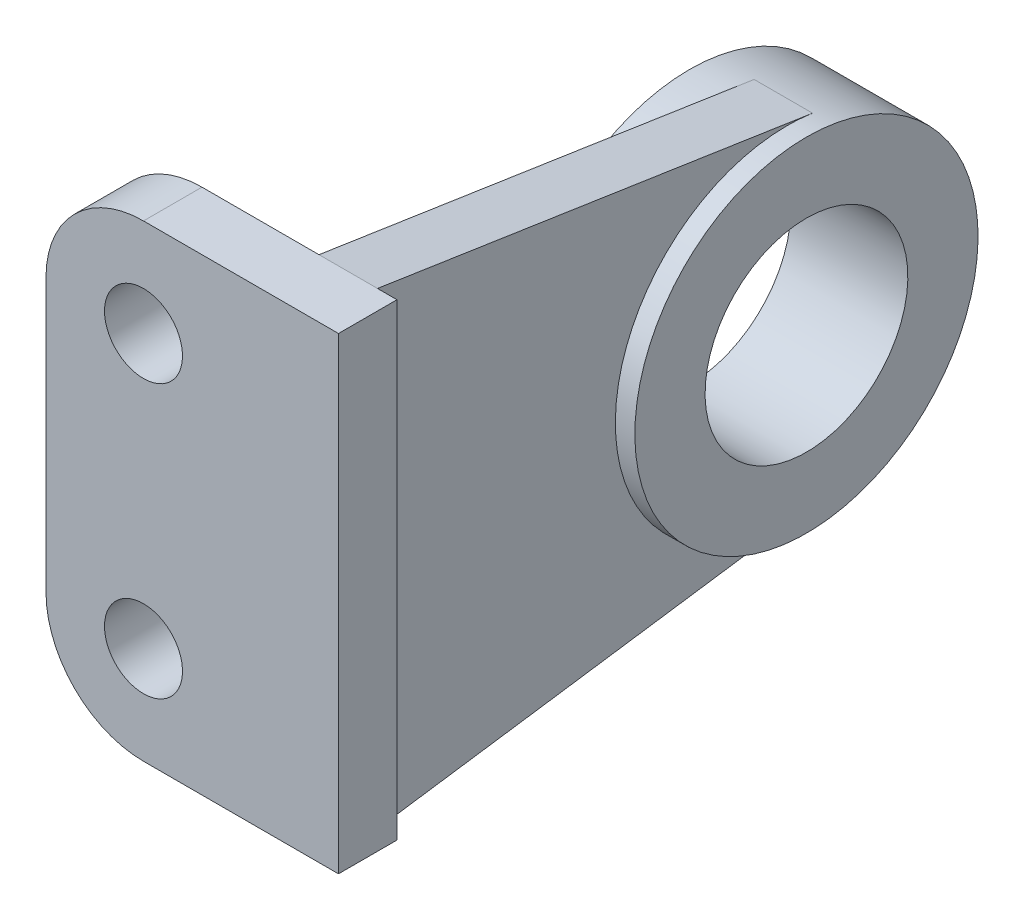
ISO-10303-21;
HEADER;
FILE_DESCRIPTION(('STEP AP214'),'2;1');
FILE_NAME('part.step','',(''),(''),'','','');
FILE_SCHEMA(('AUTOMOTIVE_DESIGN { 1 0 10303 214 1 1 1 1 }'));
ENDSEC;
DATA;
#1=APPLICATION_CONTEXT('core data for automotive mechanical design processes');
#2=APPLICATION_PROTOCOL_DEFINITION('international standard','automotive_design',2000,#1);
#3=PRODUCT_CONTEXT('',#1,'mechanical');
#4=PRODUCT('Part','Part','',(#3));
#5=PRODUCT_RELATED_PRODUCT_CATEGORY('part','',(#4));
#6=PRODUCT_DEFINITION_FORMATION('','',#4);
#7=PRODUCT_DEFINITION_CONTEXT('part definition',#1,'design');
#8=PRODUCT_DEFINITION('design','',#6,#7);
#9=PRODUCT_DEFINITION_SHAPE('','',#8);
#10=(LENGTH_UNIT() NAMED_UNIT(*) SI_UNIT(.MILLI.,.METRE.));
#11=(NAMED_UNIT(*) PLANE_ANGLE_UNIT() SI_UNIT($,.RADIAN.));
#12=(NAMED_UNIT(*) SI_UNIT($,.STERADIAN.) SOLID_ANGLE_UNIT());
#13=UNCERTAINTY_MEASURE_WITH_UNIT(LENGTH_MEASURE(1.E-05),#10,'distance_accuracy_value','');
#14=(GEOMETRIC_REPRESENTATION_CONTEXT(3) GLOBAL_UNCERTAINTY_ASSIGNED_CONTEXT((#13)) GLOBAL_UNIT_ASSIGNED_CONTEXT((#10,
#11,#12)) REPRESENTATION_CONTEXT('',''));
#15=CARTESIAN_POINT('',(0.,0.,0.));
#16=DIRECTION('',(0.,0.,1.));
#17=DIRECTION('',(1.,0.,0.));
#18=AXIS2_PLACEMENT_3D('',#15,#16,#17);
#19=CARTESIAN_POINT('',(17.5,-58.772503366237,-8.49370649598173));
#20=DIRECTION('',(0.,-0.989718001640172,-0.143032434186739));
#21=DIRECTION('',(0.,0.143032434186739,-0.989718001640172));
#22=AXIS2_PLACEMENT_3D('',#19,#20,#21);
#23=PLANE('',#22);
#24=DIRECTION('',(0.,0.143032434186739,-0.989718001640172));
#25=VECTOR('',#24,1.);
#26=CARTESIAN_POINT('',(32.5,-58.772503366237,-8.49370649598173));
#27=LINE('',#26,#25);
#28=CARTESIAN_POINT('',(32.5,-60.,0.));
#29=VERTEX_POINT('',#28);
#30=CARTESIAN_POINT('',(32.5,-43.916055117397,-111.293427104217));
#31=VERTEX_POINT('',#30);
#32=EDGE_CURVE('E150',#29,#31,#27,.T.);
#33=ORIENTED_EDGE('',*,*,#32,.F.);
#34=DIRECTION('',(1.,0.,0.));
#35=VECTOR('',#34,1.);
#36=CARTESIAN_POINT('',(17.5,-60.,0.));
#37=LINE('',#36,#35);
#38=CARTESIAN_POINT('',(17.5,-60.,0.));
#39=VERTEX_POINT('',#38);
#40=EDGE_CURVE('E56',#39,#29,#37,.T.);
#41=ORIENTED_EDGE('',*,*,#40,.F.);
#42=DIRECTION('',(0.,0.143032434186739,-0.989718001640172));
#43=VECTOR('',#42,1.);
#44=CARTESIAN_POINT('',(17.5,-58.772503366237,-8.49370649598173));
#45=LINE('',#44,#43);
#46=CARTESIAN_POINT('',(17.5,-43.9160551173963,-111.293427104216));
#47=VERTEX_POINT('',#46);
#48=EDGE_CURVE('E151',#39,#47,#45,.T.);
#49=ORIENTED_EDGE('',*,*,#48,.T.);
#50=DIRECTION('',(1.,0.,0.));
#51=VECTOR('',#50,1.);
#52=CARTESIAN_POINT('',(17.5,-43.9160551173963,-111.293427104216));
#53=LINE('',#52,#51);
#54=EDGE_CURVE('E157',#47,#31,#53,.T.);
#55=ORIENTED_EDGE('',*,*,#54,.T.);
#56=EDGE_LOOP('',(#33,#41,#49,#55));
#57=FACE_BOUND('',#56,.T.);
#58=ADVANCED_FACE('F48',(#57),#23,.T.);
#59=CARTESIAN_POINT('',(17.5,0.,0.));
#60=DIRECTION('',(0.,0.,-1.));
#61=DIRECTION('',(-1.,0.,0.));
#62=AXIS2_PLACEMENT_3D('',#59,#60,#61);
#63=PLANE('',#62);
#64=DIRECTION('',(0.,1.,0.));
#65=VECTOR('',#64,1.);
#66=CARTESIAN_POINT('',(32.5,0.,0.));
#67=LINE('',#66,#65);
#68=CARTESIAN_POINT('',(32.5,60.,0.));
#69=VERTEX_POINT('',#68);
#70=EDGE_CURVE('E78',#29,#69,#67,.T.);
#71=ORIENTED_EDGE('',*,*,#70,.T.);
#72=DIRECTION('',(1.,0.,0.));
#73=VECTOR('',#72,1.);
#74=CARTESIAN_POINT('',(17.5,60.,0.));
#75=LINE('',#74,#73);
#76=CARTESIAN_POINT('',(17.5,60.,0.));
#77=VERTEX_POINT('',#76);
#78=EDGE_CURVE('E164',#77,#69,#75,.T.);
#79=ORIENTED_EDGE('',*,*,#78,.F.);
#80=DIRECTION('',(0.,1.,0.));
#81=VECTOR('',#80,1.);
#82=CARTESIAN_POINT('',(17.5,0.,0.));
#83=LINE('',#82,#81);
#84=EDGE_CURVE('E155',#39,#77,#83,.T.);
#85=ORIENTED_EDGE('',*,*,#84,.F.);
#86=ORIENTED_EDGE('',*,*,#40,.T.);
#87=EDGE_LOOP('',(#71,#79,#85,#86));
#88=FACE_BOUND('',#87,.T.);
#89=ADVANCED_FACE('F179',(#88),#63,.F.);
#90=CARTESIAN_POINT('',(17.5,58.6601596680062,-8.86539608840981));
#91=DIRECTION('',(0.,-0.988771625705402,0.149434508062552));
#92=DIRECTION('',(0.,-0.149434508062552,-0.988771625705402));
#93=AXIS2_PLACEMENT_3D('',#90,#91,#92);
#94=PLANE('',#93);
#95=DIRECTION('',(0.,-0.149434508062552,-0.988771625705402));
#96=VECTOR('',#95,1.);
#97=CARTESIAN_POINT('',(32.5,58.6601596680062,-8.86539608840981));
#98=LINE('',#97,#96);
#99=CARTESIAN_POINT('',(32.5,43.1374884858075,-111.575118354752));
#100=VERTEX_POINT('',#99);
#101=EDGE_CURVE('E159',#69,#100,#98,.T.);
#102=ORIENTED_EDGE('',*,*,#101,.T.);
#103=DIRECTION('',(1.,0.,0.));
#104=VECTOR('',#103,1.);
#105=CARTESIAN_POINT('',(17.5,43.1374884858075,-111.575118354752));
#106=LINE('',#105,#104);
#107=CARTESIAN_POINT('',(17.5,43.1374884858082,-111.575118354752));
#108=VERTEX_POINT('',#107);
#109=EDGE_CURVE('E166',#108,#100,#106,.T.);
#110=ORIENTED_EDGE('',*,*,#109,.F.);
#111=DIRECTION('',(0.,-0.149434508062552,-0.988771625705402));
#112=VECTOR('',#111,1.);
#113=CARTESIAN_POINT('',(17.5,58.6601596680062,-8.86539608840981));
#114=LINE('',#113,#112);
#115=EDGE_CURVE('E153',#77,#108,#114,.T.);
#116=ORIENTED_EDGE('',*,*,#115,.F.);
#117=ORIENTED_EDGE('',*,*,#78,.T.);
#118=EDGE_LOOP('',(#102,#110,#116,#117));
#119=FACE_BOUND('',#118,.T.);
#120=ADVANCED_FACE('F177',(#119),#94,.F.);
#121=CARTESIAN_POINT('',(17.5,-0.36846304522945,-105.));
#122=DIRECTION('',(1.,0.,0.));
#123=DIRECTION('',(0.,1.,0.));
#124=AXIS2_PLACEMENT_3D('',#121,#122,#123);
#125=CYLINDRICAL_SURFACE('',#124,43.9999999999985);
#126=ORIENTED_EDGE('',*,*,#109,.T.);
#127=CARTESIAN_POINT('',(32.5,-0.368463045229448,-105.));
#128=DIRECTION('',(1.,0.,0.));
#129=DIRECTION('',(0.,1.,0.));
#130=AXIS2_PLACEMENT_3D('',#127,#128,#129);
#131=CIRCLE('',#130,44.);
#132=EDGE_CURVE('E12',#100,#31,#131,.T.);
#133=ORIENTED_EDGE('',*,*,#132,.T.);
#134=ORIENTED_EDGE('',*,*,#54,.F.);
#135=CARTESIAN_POINT('',(17.5,-0.36846304522945,-105.));
#136=DIRECTION('',(1.,0.,0.));
#137=DIRECTION('',(0.,1.,0.));
#138=AXIS2_PLACEMENT_3D('',#135,#136,#137);
#139=CIRCLE('',#138,44.);
#140=EDGE_CURVE('E85',#108,#47,#139,.T.);
#141=ORIENTED_EDGE('',*,*,#140,.F.);
#142=EDGE_LOOP('',(#126,#133,#134,#141));
#143=FACE_BOUND('',#142,.T.);
#144=CARTESIAN_POINT('',(37.5,-0.368463045229447,-105.));
#145=DIRECTION('',(1.,0.,0.));
#146=DIRECTION('',(0.,1.,0.));
#147=AXIS2_PLACEMENT_3D('',#144,#145,#146);
#148=CIRCLE('',#147,44.);
#149=CARTESIAN_POINT('',(37.5,43.6315369547706,-105.));
#150=VERTEX_POINT('',#149);
#151=EDGE_CURVE('E140',#150,#150,#148,.T.);
#152=ORIENTED_EDGE('',*,*,#151,.F.);
#153=EDGE_LOOP('',(#152));
#154=FACE_BOUND('',#153,.T.);
#155=CARTESIAN_POINT('',(7.5,-0.368463045229451,-105.));
#156=DIRECTION('',(1.,0.,0.));
#157=DIRECTION('',(0.,1.,0.));
#158=AXIS2_PLACEMENT_3D('',#155,#156,#157);
#159=CIRCLE('',#158,44.);
#160=CARTESIAN_POINT('',(7.49999999999999,43.6315369547706,-105.));
#161=VERTEX_POINT('',#160);
#162=EDGE_CURVE('E146',#161,#161,#159,.T.);
#163=ORIENTED_EDGE('',*,*,#162,.T.);
#164=EDGE_LOOP('',(#163));
#165=FACE_BOUND('',#164,.T.);
#166=ADVANCED_FACE('F170',(#143,#154,#165),#125,.T.);
#167=CARTESIAN_POINT('',(17.5,0.,0.));
#168=DIRECTION('',(1.,0.,0.));
#169=DIRECTION('',(0.,1.,0.));
#170=AXIS2_PLACEMENT_3D('',#167,#168,#169);
#171=PLANE('',#170);
#172=ORIENTED_EDGE('',*,*,#115,.T.);
#173=ORIENTED_EDGE('',*,*,#140,.T.);
#174=ORIENTED_EDGE('',*,*,#48,.F.);
#175=ORIENTED_EDGE('',*,*,#84,.T.);
#176=EDGE_LOOP('',(#172,#173,#174,#175));
#177=FACE_BOUND('',#176,.T.);
#178=ADVANCED_FACE('F180',(#177),#171,.F.);
#179=CARTESIAN_POINT('',(32.5,0.,0.));
#180=DIRECTION('',(1.,0.,0.));
#181=DIRECTION('',(0.,1.,0.));
#182=AXIS2_PLACEMENT_3D('',#179,#180,#181);
#183=PLANE('',#182);
#184=ORIENTED_EDGE('',*,*,#132,.F.);
#185=ORIENTED_EDGE('',*,*,#101,.F.);
#186=ORIENTED_EDGE('',*,*,#70,.F.);
#187=ORIENTED_EDGE('',*,*,#32,.T.);
#188=EDGE_LOOP('',(#184,#185,#186,#187));
#189=FACE_BOUND('',#188,.T.);
#190=ADVANCED_FACE('F175',(#189),#183,.T.);
#191=CARTESIAN_POINT('',(37.5,-0.368463045229447,-105.));
#192=DIRECTION('',(1.,0.,0.));
#193=DIRECTION('',(0.,1.,0.));
#194=AXIS2_PLACEMENT_3D('',#191,#192,#193);
#195=PLANE('',#194);
#196=ORIENTED_EDGE('',*,*,#151,.T.);
#197=EDGE_LOOP('',(#196));
#198=FACE_BOUND('',#197,.T.);
#199=CARTESIAN_POINT('',(37.5,-0.368463045229447,-105.));
#200=DIRECTION('',(1.,0.,0.));
#201=DIRECTION('',(0.,1.,0.));
#202=AXIS2_PLACEMENT_3D('',#199,#200,#201);
#203=CIRCLE('',#202,25.9999999999985);
#204=CARTESIAN_POINT('',(37.5,25.6315369547691,-105.));
#205=VERTEX_POINT('',#204);
#206=EDGE_CURVE('E137',#205,#205,#203,.T.);
#207=ORIENTED_EDGE('',*,*,#206,.F.);
#208=EDGE_LOOP('',(#207));
#209=FACE_BOUND('',#208,.T.);
#210=ADVANCED_FACE('F187',(#198,#209),#195,.T.);
#211=CARTESIAN_POINT('',(7.5,-0.368463045229451,-105.));
#212=DIRECTION('',(1.,0.,0.));
#213=DIRECTION('',(0.,1.,0.));
#214=AXIS2_PLACEMENT_3D('',#211,#212,#213);
#215=PLANE('',#214);
#216=CARTESIAN_POINT('',(7.5,-0.368463045229451,-140.));
#217=DIRECTION('',(-1.,0.,0.));
#218=DIRECTION('',(0.,0.,1.));
#219=AXIS2_PLACEMENT_3D('',#216,#217,#218);
#220=CIRCLE('',#219,3.39999999999999);
#221=CARTESIAN_POINT('',(7.5,-0.368463045229451,-136.6));
#222=VERTEX_POINT('',#221);
#223=EDGE_CURVE('E115',#222,#222,#220,.T.);
#224=ORIENTED_EDGE('',*,*,#223,.F.);
#225=EDGE_LOOP('',(#224));
#226=FACE_BOUND('',#225,.T.);
#227=CARTESIAN_POINT('',(7.5,34.6315369547706,-105.));
#228=DIRECTION('',(-1.,0.,0.));
#229=DIRECTION('',(0.,0.,1.));
#230=AXIS2_PLACEMENT_3D('',#227,#228,#229);
#231=CIRCLE('',#230,3.39999999999999);
#232=CARTESIAN_POINT('',(7.5,34.6315369547706,-101.6));
#233=VERTEX_POINT('',#232);
#234=EDGE_CURVE('E114',#233,#233,#231,.T.);
#235=ORIENTED_EDGE('',*,*,#234,.F.);
#236=EDGE_LOOP('',(#235));
#237=FACE_BOUND('',#236,.T.);
#238=CARTESIAN_POINT('',(7.5,-0.368463045229451,-70.));
#239=DIRECTION('',(-1.,0.,0.));
#240=DIRECTION('',(0.,0.,1.));
#241=AXIS2_PLACEMENT_3D('',#238,#239,#240);
#242=CIRCLE('',#241,3.39999999999999);
#243=CARTESIAN_POINT('',(7.5,-0.368463045229451,-66.6));
#244=VERTEX_POINT('',#243);
#245=EDGE_CURVE('E125',#244,#244,#242,.T.);
#246=ORIENTED_EDGE('',*,*,#245,.F.);
#247=EDGE_LOOP('',(#246));
#248=FACE_BOUND('',#247,.T.);
#249=CARTESIAN_POINT('',(7.5,-35.3684630452295,-105.));
#250=DIRECTION('',(-1.,0.,0.));
#251=DIRECTION('',(0.,0.,1.));
#252=AXIS2_PLACEMENT_3D('',#249,#250,#251);
#253=CIRCLE('',#252,3.39999999999999);
#254=CARTESIAN_POINT('',(7.5,-35.3684630452295,-101.6));
#255=VERTEX_POINT('',#254);
#256=EDGE_CURVE('E131',#255,#255,#253,.T.);
#257=ORIENTED_EDGE('',*,*,#256,.F.);
#258=EDGE_LOOP('',(#257));
#259=FACE_BOUND('',#258,.T.);
#260=CARTESIAN_POINT('',(7.5,-0.368463045229451,-105.));
#261=DIRECTION('',(1.,0.,0.));
#262=DIRECTION('',(0.,1.,0.));
#263=AXIS2_PLACEMENT_3D('',#260,#261,#262);
#264=CIRCLE('',#263,25.9999999999985);
#265=CARTESIAN_POINT('',(7.5,25.6315369547691,-105.));
#266=VERTEX_POINT('',#265);
#267=EDGE_CURVE('E143',#266,#266,#264,.T.);
#268=ORIENTED_EDGE('',*,*,#267,.T.);
#269=EDGE_LOOP('',(#268));
#270=FACE_BOUND('',#269,.T.);
#271=ORIENTED_EDGE('',*,*,#162,.F.);
#272=EDGE_LOOP('',(#271));
#273=FACE_BOUND('',#272,.T.);
#274=ADVANCED_FACE('F203',(#226,#237,#248,#259,#270,#273),#215,.F.);
#275=CARTESIAN_POINT('',(17.5,-0.36846304522945,-105.));
#276=DIRECTION('',(1.,0.,0.));
#277=DIRECTION('',(0.,1.,0.));
#278=AXIS2_PLACEMENT_3D('',#275,#276,#277);
#279=CYLINDRICAL_SURFACE('',#278,25.9999999999985);
#280=ORIENTED_EDGE('',*,*,#206,.T.);
#281=EDGE_LOOP('',(#280));
#282=FACE_BOUND('',#281,.T.);
#283=ORIENTED_EDGE('',*,*,#267,.F.);
#284=EDGE_LOOP('',(#283));
#285=FACE_BOUND('',#284,.T.);
#286=ADVANCED_FACE('F200',(#282,#285),#279,.F.);
#287=CARTESIAN_POINT('',(23.5,-35.3684630452295,-105.));
#288=DIRECTION('',(-1.,0.,0.));
#289=DIRECTION('',(0.,0.,1.));
#290=AXIS2_PLACEMENT_3D('',#287,#288,#289);
#291=CONICAL_SURFACE('',#290,3.39999999999999,1.02974425867665);
#292=CARTESIAN_POINT('',(25.5429261046937,-35.3684630452295,-105.));
#293=VERTEX_POINT('',#292);
#294=VERTEX_LOOP('',#293);
#295=FACE_BOUND('',#294,.T.);
#296=CARTESIAN_POINT('',(23.5,-35.3684630452295,-105.));
#297=DIRECTION('',(-1.,0.,0.));
#298=DIRECTION('',(0.,0.,1.));
#299=AXIS2_PLACEMENT_3D('',#296,#297,#298);
#300=CIRCLE('',#299,3.39999999999999);
#301=CARTESIAN_POINT('',(23.5,-35.3684630452295,-101.6));
#302=VERTEX_POINT('',#301);
#303=EDGE_CURVE('E134',#302,#302,#300,.T.);
#304=ORIENTED_EDGE('',*,*,#303,.T.);
#305=EDGE_LOOP('',(#304));
#306=FACE_BOUND('',#305,.T.);
#307=ADVANCED_FACE('F202',(#295,#306),#291,.F.);
#308=CARTESIAN_POINT('',(7.5,-35.3684630452295,-105.));
#309=DIRECTION('',(-1.,0.,0.));
#310=DIRECTION('',(0.,0.,1.));
#311=AXIS2_PLACEMENT_3D('',#308,#309,#310);
#312=CYLINDRICAL_SURFACE('',#311,3.39999999999999);
#313=ORIENTED_EDGE('',*,*,#303,.F.);
#314=EDGE_LOOP('',(#313));
#315=FACE_BOUND('',#314,.T.);
#316=ORIENTED_EDGE('',*,*,#256,.T.);
#317=EDGE_LOOP('',(#316));
#318=FACE_BOUND('',#317,.T.);
#319=ADVANCED_FACE('F209',(#315,#318),#312,.F.);
#320=CARTESIAN_POINT('',(23.5,-0.368463045229451,-70.));
#321=DIRECTION('',(-1.,0.,0.));
#322=DIRECTION('',(0.,0.,1.));
#323=AXIS2_PLACEMENT_3D('',#320,#321,#322);
#324=CONICAL_SURFACE('',#323,3.39999999999999,1.02974425867665);
#325=CARTESIAN_POINT('',(25.5429261046937,-0.368463045229455,-70.));
#326=VERTEX_POINT('',#325);
#327=VERTEX_LOOP('',#326);
#328=FACE_BOUND('',#327,.T.);
#329=CARTESIAN_POINT('',(23.5,-0.368463045229451,-70.));
#330=DIRECTION('',(-1.,0.,0.));
#331=DIRECTION('',(0.,0.,1.));
#332=AXIS2_PLACEMENT_3D('',#329,#330,#331);
#333=CIRCLE('',#332,3.39999999999999);
#334=CARTESIAN_POINT('',(23.5,-0.368463045229451,-66.6));
#335=VERTEX_POINT('',#334);
#336=EDGE_CURVE('E128',#335,#335,#333,.T.);
#337=ORIENTED_EDGE('',*,*,#336,.T.);
#338=EDGE_LOOP('',(#337));
#339=FACE_BOUND('',#338,.T.);
#340=ADVANCED_FACE('F229',(#328,#339),#324,.F.);
#341=CARTESIAN_POINT('',(7.5,-0.368463045229451,-70.));
#342=DIRECTION('',(-1.,0.,0.));
#343=DIRECTION('',(0.,0.,1.));
#344=AXIS2_PLACEMENT_3D('',#341,#342,#343);
#345=CYLINDRICAL_SURFACE('',#344,3.39999999999999);
#346=ORIENTED_EDGE('',*,*,#336,.F.);
#347=EDGE_LOOP('',(#346));
#348=FACE_BOUND('',#347,.T.);
#349=ORIENTED_EDGE('',*,*,#245,.T.);
#350=EDGE_LOOP('',(#349));
#351=FACE_BOUND('',#350,.T.);
#352=ADVANCED_FACE('F233',(#348,#351),#345,.F.);
#353=CARTESIAN_POINT('',(23.5,34.6315369547706,-105.));
#354=DIRECTION('',(-1.,0.,0.));
#355=DIRECTION('',(0.,0.,1.));
#356=AXIS2_PLACEMENT_3D('',#353,#354,#355);
#357=CONICAL_SURFACE('',#356,3.39999999999999,1.02974425867665);
#358=CARTESIAN_POINT('',(25.5429261046937,34.6315369547705,-105.));
#359=VERTEX_POINT('',#358);
#360=VERTEX_LOOP('',#359);
#361=FACE_BOUND('',#360,.T.);
#362=CARTESIAN_POINT('',(23.5,34.6315369547706,-105.));
#363=DIRECTION('',(-1.,0.,0.));
#364=DIRECTION('',(0.,0.,1.));
#365=AXIS2_PLACEMENT_3D('',#362,#363,#364);
#366=CIRCLE('',#365,3.39999999999999);
#367=CARTESIAN_POINT('',(23.5,34.6315369547706,-101.6));
#368=VERTEX_POINT('',#367);
#369=EDGE_CURVE('E118',#368,#368,#366,.T.);
#370=ORIENTED_EDGE('',*,*,#369,.T.);
#371=EDGE_LOOP('',(#370));
#372=FACE_BOUND('',#371,.T.);
#373=ADVANCED_FACE('F237',(#361,#372),#357,.F.);
#374=CARTESIAN_POINT('',(7.5,34.6315369547706,-105.));
#375=DIRECTION('',(-1.,0.,0.));
#376=DIRECTION('',(0.,0.,1.));
#377=AXIS2_PLACEMENT_3D('',#374,#375,#376);
#378=CYLINDRICAL_SURFACE('',#377,3.39999999999999);
#379=ORIENTED_EDGE('',*,*,#369,.F.);
#380=EDGE_LOOP('',(#379));
#381=FACE_BOUND('',#380,.T.);
#382=ORIENTED_EDGE('',*,*,#234,.T.);
#383=EDGE_LOOP('',(#382));
#384=FACE_BOUND('',#383,.T.);
#385=ADVANCED_FACE('F108',(#381,#384),#378,.F.);
#386=CARTESIAN_POINT('',(23.5,-0.368463045229451,-140.));
#387=DIRECTION('',(-1.,0.,0.));
#388=DIRECTION('',(0.,0.,1.));
#389=AXIS2_PLACEMENT_3D('',#386,#387,#388);
#390=CONICAL_SURFACE('',#389,3.39999999999999,1.02974425867665);
#391=CARTESIAN_POINT('',(25.5429261046937,-0.368463045229455,-140.));
#392=VERTEX_POINT('',#391);
#393=VERTEX_LOOP('',#392);
#394=FACE_BOUND('',#393,.T.);
#395=CARTESIAN_POINT('',(23.5,-0.368463045229451,-140.));
#396=DIRECTION('',(-1.,0.,0.));
#397=DIRECTION('',(0.,0.,1.));
#398=AXIS2_PLACEMENT_3D('',#395,#396,#397);
#399=CIRCLE('',#398,3.39999999999999);
#400=CARTESIAN_POINT('',(23.5,-0.368463045229451,-136.6));
#401=VERTEX_POINT('',#400);
#402=EDGE_CURVE('E112',#401,#401,#399,.T.);
#403=ORIENTED_EDGE('',*,*,#402,.T.);
#404=EDGE_LOOP('',(#403));
#405=FACE_BOUND('',#404,.T.);
#406=ADVANCED_FACE('F104',(#394,#405),#390,.F.);
#407=CARTESIAN_POINT('',(7.5,-0.368463045229451,-140.));
#408=DIRECTION('',(-1.,0.,0.));
#409=DIRECTION('',(0.,0.,1.));
#410=AXIS2_PLACEMENT_3D('',#407,#408,#409);
#411=CYLINDRICAL_SURFACE('',#410,3.39999999999999);
#412=ORIENTED_EDGE('',*,*,#402,.F.);
#413=EDGE_LOOP('',(#412));
#414=FACE_BOUND('',#413,.T.);
#415=ORIENTED_EDGE('',*,*,#223,.T.);
#416=EDGE_LOOP('',(#415));
#417=FACE_BOUND('',#416,.T.);
#418=ADVANCED_FACE('F107',(#414,#417),#411,.F.);
#419=CLOSED_SHELL('',(#58,#89,#120,#166,#178,#190,#210,#274,#286,#307,#319,#340,#352,#373,#385,
#406,#418));
#420=MANIFOLD_SOLID_BREP('B2',#419);
#421=CARTESIAN_POINT('',(37.5,60.,15.));
#422=DIRECTION('',(-1.,0.,0.));
#423=DIRECTION('',(0.,-1.,0.));
#424=AXIS2_PLACEMENT_3D('',#421,#422,#423);
#425=PLANE('',#424);
#426=DIRECTION('',(0.,1.,0.));
#427=VECTOR('',#426,1.);
#428=CARTESIAN_POINT('',(37.5,60.,0.));
#429=LINE('',#428,#427);
#430=CARTESIAN_POINT('',(37.5,-60.,0.));
#431=VERTEX_POINT('',#430);
#432=CARTESIAN_POINT('',(37.5,60.,0.));
#433=VERTEX_POINT('',#432);
#434=EDGE_CURVE('E456',#431,#433,#429,.T.);
#435=ORIENTED_EDGE('',*,*,#434,.T.);
#436=DIRECTION('',(0.,0.,-1.));
#437=VECTOR('',#436,1.);
#438=CARTESIAN_POINT('',(37.5,60.,15.));
#439=LINE('',#438,#437);
#440=CARTESIAN_POINT('',(37.5,60.,15.));
#441=VERTEX_POINT('',#440);
#442=EDGE_CURVE('E474',#441,#433,#439,.T.);
#443=ORIENTED_EDGE('',*,*,#442,.F.);
#444=DIRECTION('',(0.,1.,0.));
#445=VECTOR('',#444,1.);
#446=CARTESIAN_POINT('',(37.5,60.,15.));
#447=LINE('',#446,#445);
#448=CARTESIAN_POINT('',(37.5,-60.,15.));
#449=VERTEX_POINT('',#448);
#450=EDGE_CURVE('E467',#449,#441,#447,.T.);
#451=ORIENTED_EDGE('',*,*,#450,.F.);
#452=DIRECTION('',(0.,0.,-1.));
#453=VECTOR('',#452,1.);
#454=CARTESIAN_POINT('',(37.5,-60.,15.));
#455=LINE('',#454,#453);
#456=EDGE_CURVE('E452',#449,#431,#455,.T.);
#457=ORIENTED_EDGE('',*,*,#456,.T.);
#458=EDGE_LOOP('',(#435,#443,#451,#457));
#459=FACE_BOUND('',#458,.T.);
#460=ADVANCED_FACE('F370',(#459),#425,.F.);
#461=CARTESIAN_POINT('',(37.5,60.,15.));
#462=DIRECTION('',(0.,-1.,0.));
#463=DIRECTION('',(1.,0.,0.));
#464=AXIS2_PLACEMENT_3D('',#461,#462,#463);
#465=PLANE('',#464);
#466=DIRECTION('',(-1.,0.,0.));
#467=VECTOR('',#466,1.);
#468=CARTESIAN_POINT('',(37.5,60.,0.));
#469=LINE('',#468,#467);
#470=CARTESIAN_POINT('',(-12.5,60.,0.));
#471=VERTEX_POINT('',#470);
#472=EDGE_CURVE('E459',#433,#471,#469,.T.);
#473=ORIENTED_EDGE('',*,*,#472,.T.);
#474=DIRECTION('',(0.,0.,-1.));
#475=VECTOR('',#474,1.);
#476=CARTESIAN_POINT('',(-12.5,60.,15.));
#477=LINE('',#476,#475);
#478=CARTESIAN_POINT('',(-12.5,60.,15.));
#479=VERTEX_POINT('',#478);
#480=EDGE_CURVE('E471',#479,#471,#477,.T.);
#481=ORIENTED_EDGE('',*,*,#480,.F.);
#482=DIRECTION('',(-1.,0.,0.));
#483=VECTOR('',#482,1.);
#484=CARTESIAN_POINT('',(37.5,60.,15.));
#485=LINE('',#484,#483);
#486=EDGE_CURVE('E425',#441,#479,#485,.T.);
#487=ORIENTED_EDGE('',*,*,#486,.F.);
#488=ORIENTED_EDGE('',*,*,#442,.T.);
#489=EDGE_LOOP('',(#473,#481,#487,#488));
#490=FACE_BOUND('',#489,.T.);
#491=ADVANCED_FACE('F511',(#490),#465,.F.);
#492=CARTESIAN_POINT('',(-12.5,35.,15.));
#493=DIRECTION('',(0.,0.,-1.));
#494=DIRECTION('',(-1.,0.,0.));
#495=AXIS2_PLACEMENT_3D('',#492,#493,#494);
#496=CYLINDRICAL_SURFACE('',#495,25.);
#497=CARTESIAN_POINT('',(-12.5,35.,0.));
#498=DIRECTION('',(0.,0.,1.));
#499=DIRECTION('',(-1.,0.,0.));
#500=AXIS2_PLACEMENT_3D('',#497,#498,#499);
#501=CIRCLE('',#500,25.);
#502=CARTESIAN_POINT('',(-37.5,35.,0.));
#503=VERTEX_POINT('',#502);
#504=EDGE_CURVE('E462',#471,#503,#501,.T.);
#505=ORIENTED_EDGE('',*,*,#504,.T.);
#506=DIRECTION('',(0.,0.,-1.));
#507=VECTOR('',#506,1.);
#508=CARTESIAN_POINT('',(-37.5,35.,15.));
#509=LINE('',#508,#507);
#510=CARTESIAN_POINT('',(-37.5,35.,15.));
#511=VERTEX_POINT('',#510);
#512=EDGE_CURVE('E447',#511,#503,#509,.T.);
#513=ORIENTED_EDGE('',*,*,#512,.F.);
#514=CARTESIAN_POINT('',(-12.5,35.,15.));
#515=DIRECTION('',(0.,0.,1.));
#516=DIRECTION('',(-1.,0.,0.));
#517=AXIS2_PLACEMENT_3D('',#514,#515,#516);
#518=CIRCLE('',#517,25.);
#519=EDGE_CURVE('E438',#479,#511,#518,.T.);
#520=ORIENTED_EDGE('',*,*,#519,.F.);
#521=ORIENTED_EDGE('',*,*,#480,.T.);
#522=EDGE_LOOP('',(#505,#513,#520,#521));
#523=FACE_BOUND('',#522,.T.);
#524=ADVANCED_FACE('F514',(#523),#496,.T.);
#525=CARTESIAN_POINT('',(-37.5,35.,15.));
#526=DIRECTION('',(1.,0.,0.));
#527=DIRECTION('',(0.,1.,0.));
#528=AXIS2_PLACEMENT_3D('',#525,#526,#527);
#529=PLANE('',#528);
#530=DIRECTION('',(0.,-1.,0.));
#531=VECTOR('',#530,1.);
#532=CARTESIAN_POINT('',(-37.5,35.,0.));
#533=LINE('',#532,#531);
#534=CARTESIAN_POINT('',(-37.5,-35.,0.));
#535=VERTEX_POINT('',#534);
#536=EDGE_CURVE('E446',#503,#535,#533,.T.);
#537=ORIENTED_EDGE('',*,*,#536,.T.);
#538=DIRECTION('',(0.,0.,-1.));
#539=VECTOR('',#538,1.);
#540=CARTESIAN_POINT('',(-37.5,-35.,15.));
#541=LINE('',#540,#539);
#542=CARTESIAN_POINT('',(-37.5,-35.,15.));
#543=VERTEX_POINT('',#542);
#544=EDGE_CURVE('E443',#543,#535,#541,.T.);
#545=ORIENTED_EDGE('',*,*,#544,.F.);
#546=DIRECTION('',(0.,-1.,0.));
#547=VECTOR('',#546,1.);
#548=CARTESIAN_POINT('',(-37.5,35.,15.));
#549=LINE('',#548,#547);
#550=EDGE_CURVE('E432',#511,#543,#549,.T.);
#551=ORIENTED_EDGE('',*,*,#550,.F.);
#552=ORIENTED_EDGE('',*,*,#512,.T.);
#553=EDGE_LOOP('',(#537,#545,#551,#552));
#554=FACE_BOUND('',#553,.T.);
#555=ADVANCED_FACE('F444',(#554),#529,.F.);
#556=CARTESIAN_POINT('',(-12.5,-35.,15.));
#557=DIRECTION('',(0.,0.,-1.));
#558=DIRECTION('',(-1.,0.,0.));
#559=AXIS2_PLACEMENT_3D('',#556,#557,#558);
#560=CYLINDRICAL_SURFACE('',#559,25.);
#561=CARTESIAN_POINT('',(-12.5,-35.,0.));
#562=DIRECTION('',(0.,0.,1.));
#563=DIRECTION('',(-1.,0.,0.));
#564=AXIS2_PLACEMENT_3D('',#561,#562,#563);
#565=CIRCLE('',#564,25.);
#566=CARTESIAN_POINT('',(-12.5,-60.,0.));
#567=VERTEX_POINT('',#566);
#568=EDGE_CURVE('E410',#535,#567,#565,.T.);
#569=ORIENTED_EDGE('',*,*,#568,.T.);
#570=DIRECTION('',(0.,0.,-1.));
#571=VECTOR('',#570,1.);
#572=CARTESIAN_POINT('',(-12.5,-60.,15.));
#573=LINE('',#572,#571);
#574=CARTESIAN_POINT('',(-12.5,-60.,15.));
#575=VERTEX_POINT('',#574);
#576=EDGE_CURVE('E448',#575,#567,#573,.T.);
#577=ORIENTED_EDGE('',*,*,#576,.F.);
#578=CARTESIAN_POINT('',(-12.5,-35.,15.));
#579=DIRECTION('',(0.,0.,1.));
#580=DIRECTION('',(-1.,0.,0.));
#581=AXIS2_PLACEMENT_3D('',#578,#579,#580);
#582=CIRCLE('',#581,25.);
#583=EDGE_CURVE('E436',#543,#575,#582,.T.);
#584=ORIENTED_EDGE('',*,*,#583,.F.);
#585=ORIENTED_EDGE('',*,*,#544,.T.);
#586=EDGE_LOOP('',(#569,#577,#584,#585));
#587=FACE_BOUND('',#586,.T.);
#588=ADVANCED_FACE('F450',(#587),#560,.T.);
#589=CARTESIAN_POINT('',(37.5,-60.,15.));
#590=DIRECTION('',(0.,1.,0.));
#591=DIRECTION('',(-1.,0.,0.));
#592=AXIS2_PLACEMENT_3D('',#589,#590,#591);
#593=PLANE('',#592);
#594=DIRECTION('',(1.,0.,0.));
#595=VECTOR('',#594,1.);
#596=CARTESIAN_POINT('',(37.5,-60.,0.));
#597=LINE('',#596,#595);
#598=EDGE_CURVE('E416',#567,#431,#597,.T.);
#599=ORIENTED_EDGE('',*,*,#598,.T.);
#600=ORIENTED_EDGE('',*,*,#456,.F.);
#601=DIRECTION('',(1.,0.,0.));
#602=VECTOR('',#601,1.);
#603=CARTESIAN_POINT('',(37.5,-60.,15.));
#604=LINE('',#603,#602);
#605=EDGE_CURVE('E387',#575,#449,#604,.T.);
#606=ORIENTED_EDGE('',*,*,#605,.F.);
#607=ORIENTED_EDGE('',*,*,#576,.T.);
#608=EDGE_LOOP('',(#599,#600,#606,#607));
#609=FACE_BOUND('',#608,.T.);
#610=ADVANCED_FACE('F518',(#609),#593,.F.);
#611=CARTESIAN_POINT('',(-12.5,-35.,15.));
#612=DIRECTION('',(0.,0.,-1.));
#613=DIRECTION('',(-1.,0.,0.));
#614=AXIS2_PLACEMENT_3D('',#611,#612,#613);
#615=PLANE('',#614);
#616=CARTESIAN_POINT('',(-12.5,35.,15.));
#617=DIRECTION('',(0.,0.,-1.));
#618=DIRECTION('',(-1.,0.,0.));
#619=AXIS2_PLACEMENT_3D('',#616,#617,#618);
#620=CIRCLE('',#619,10.);
#621=CARTESIAN_POINT('',(-22.5,35.,15.));
#622=VERTEX_POINT('',#621);
#623=EDGE_CURVE('E504',#622,#622,#620,.T.);
#624=ORIENTED_EDGE('',*,*,#623,.T.);
#625=EDGE_LOOP('',(#624));
#626=FACE_BOUND('',#625,.T.);
#627=CARTESIAN_POINT('',(-12.5,-35.,15.));
#628=DIRECTION('',(0.,0.,-1.));
#629=DIRECTION('',(-1.,0.,0.));
#630=AXIS2_PLACEMENT_3D('',#627,#628,#629);
#631=CIRCLE('',#630,10.);
#632=CARTESIAN_POINT('',(-22.5,-35.,15.));
#633=VERTEX_POINT('',#632);
#634=EDGE_CURVE('E648',#633,#633,#631,.T.);
#635=ORIENTED_EDGE('',*,*,#634,.T.);
#636=EDGE_LOOP('',(#635));
#637=FACE_BOUND('',#636,.T.);
#638=ORIENTED_EDGE('',*,*,#450,.T.);
#639=ORIENTED_EDGE('',*,*,#486,.T.);
#640=ORIENTED_EDGE('',*,*,#519,.T.);
#641=ORIENTED_EDGE('',*,*,#550,.T.);
#642=ORIENTED_EDGE('',*,*,#583,.T.);
#643=ORIENTED_EDGE('',*,*,#605,.T.);
#644=EDGE_LOOP('',(#638,#639,#640,#641,#642,#643));
#645=FACE_BOUND('',#644,.T.);
#646=ADVANCED_FACE('F434',(#626,#637,#645),#615,.F.);
#647=CARTESIAN_POINT('',(-12.5,-35.,0.));
#648=DIRECTION('',(0.,0.,-1.));
#649=DIRECTION('',(-1.,0.,0.));
#650=AXIS2_PLACEMENT_3D('',#647,#648,#649);
#651=PLANE('',#650);
#652=CARTESIAN_POINT('',(-12.5,35.,0.));
#653=DIRECTION('',(0.,0.,-1.));
#654=DIRECTION('',(-1.,0.,0.));
#655=AXIS2_PLACEMENT_3D('',#652,#653,#654);
#656=CIRCLE('',#655,20.);
#657=CARTESIAN_POINT('',(-32.5,35.,0.));
#658=VERTEX_POINT('',#657);
#659=EDGE_CURVE('E379',#658,#658,#656,.F.);
#660=ORIENTED_EDGE('',*,*,#659,.T.);
#661=EDGE_LOOP('',(#660));
#662=FACE_BOUND('',#661,.T.);
#663=CARTESIAN_POINT('',(-12.5,-35.,0.));
#664=DIRECTION('',(0.,0.,-1.));
#665=DIRECTION('',(-1.,0.,0.));
#666=AXIS2_PLACEMENT_3D('',#663,#664,#665);
#667=CIRCLE('',#666,20.);
#668=CARTESIAN_POINT('',(-32.5,-35.,0.));
#669=VERTEX_POINT('',#668);
#670=EDGE_CURVE('E479',#669,#669,#667,.F.);
#671=ORIENTED_EDGE('',*,*,#670,.T.);
#672=EDGE_LOOP('',(#671));
#673=FACE_BOUND('',#672,.T.);
#674=ORIENTED_EDGE('',*,*,#434,.F.);
#675=ORIENTED_EDGE('',*,*,#598,.F.);
#676=ORIENTED_EDGE('',*,*,#568,.F.);
#677=ORIENTED_EDGE('',*,*,#536,.F.);
#678=ORIENTED_EDGE('',*,*,#504,.F.);
#679=ORIENTED_EDGE('',*,*,#472,.F.);
#680=EDGE_LOOP('',(#674,#675,#676,#677,#678,#679));
#681=FACE_BOUND('',#680,.T.);
#682=ADVANCED_FACE('F484',(#662,#673,#681),#651,.T.);
#683=CARTESIAN_POINT('',(-12.5,35.,-5.));
#684=DIRECTION('',(0.,0.,1.));
#685=DIRECTION('',(1.,0.,0.));
#686=AXIS2_PLACEMENT_3D('',#683,#684,#685);
#687=CYLINDRICAL_SURFACE('',#686,17.);
#688=CARTESIAN_POINT('',(-12.5,35.,-3.));
#689=DIRECTION('',(0.,0.,-1.));
#690=DIRECTION('',(-1.,0.,0.));
#691=AXIS2_PLACEMENT_3D('',#688,#689,#690);
#692=CIRCLE('',#691,17.);
#693=CARTESIAN_POINT('',(-29.5,35.,-3.));
#694=VERTEX_POINT('',#693);
#695=EDGE_CURVE('E476',#694,#694,#692,.T.);
#696=ORIENTED_EDGE('',*,*,#695,.T.);
#697=EDGE_LOOP('',(#696));
#698=FACE_BOUND('',#697,.T.);
#699=CARTESIAN_POINT('',(-12.5,35.,-5.));
#700=DIRECTION('',(0.,0.,-1.));
#701=DIRECTION('',(-1.,0.,0.));
#702=AXIS2_PLACEMENT_3D('',#699,#700,#701);
#703=CIRCLE('',#702,17.);
#704=CARTESIAN_POINT('',(-29.5,35.,-5.));
#705=VERTEX_POINT('',#704);
#706=EDGE_CURVE('E460',#705,#705,#703,.T.);
#707=ORIENTED_EDGE('',*,*,#706,.F.);
#708=EDGE_LOOP('',(#707));
#709=FACE_BOUND('',#708,.T.);
#710=ADVANCED_FACE('F493',(#698,#709),#687,.T.);
#711=CARTESIAN_POINT('',(-12.5,35.,-5.));
#712=DIRECTION('',(0.,0.,-1.));
#713=DIRECTION('',(-1.,0.,0.));
#714=AXIS2_PLACEMENT_3D('',#711,#712,#713);
#715=PLANE('',#714);
#716=CARTESIAN_POINT('',(-12.5,35.,-5.));
#717=DIRECTION('',(0.,0.,-1.));
#718=DIRECTION('',(-1.,0.,0.));
#719=AXIS2_PLACEMENT_3D('',#716,#717,#718);
#720=CIRCLE('',#719,10.);
#721=CARTESIAN_POINT('',(-22.5,35.,-5.));
#722=VERTEX_POINT('',#721);
#723=EDGE_CURVE('E647',#722,#722,#720,.T.);
#724=ORIENTED_EDGE('',*,*,#723,.F.);
#725=EDGE_LOOP('',(#724));
#726=FACE_BOUND('',#725,.T.);
#727=ORIENTED_EDGE('',*,*,#706,.T.);
#728=EDGE_LOOP('',(#727));
#729=FACE_BOUND('',#728,.T.);
#730=ADVANCED_FACE('F496',(#726,#729),#715,.T.);
#731=CARTESIAN_POINT('',(-12.5,-35.,-5.));
#732=DIRECTION('',(0.,0.,1.));
#733=DIRECTION('',(1.,0.,0.));
#734=AXIS2_PLACEMENT_3D('',#731,#732,#733);
#735=CYLINDRICAL_SURFACE('',#734,17.);
#736=CARTESIAN_POINT('',(-12.5,-35.,-3.));
#737=DIRECTION('',(0.,0.,-1.));
#738=DIRECTION('',(-1.,0.,0.));
#739=AXIS2_PLACEMENT_3D('',#736,#737,#738);
#740=CIRCLE('',#739,17.);
#741=CARTESIAN_POINT('',(-29.5,-35.,-3.));
#742=VERTEX_POINT('',#741);
#743=EDGE_CURVE('E46',#742,#742,#740,.T.);
#744=ORIENTED_EDGE('',*,*,#743,.T.);
#745=EDGE_LOOP('',(#744));
#746=FACE_BOUND('',#745,.T.);
#747=CARTESIAN_POINT('',(-12.5,-35.,-5.));
#748=DIRECTION('',(0.,0.,-1.));
#749=DIRECTION('',(-1.,0.,0.));
#750=AXIS2_PLACEMENT_3D('',#747,#748,#749);
#751=CIRCLE('',#750,17.);
#752=CARTESIAN_POINT('',(-29.5,-35.,-5.));
#753=VERTEX_POINT('',#752);
#754=EDGE_CURVE('E501',#753,#753,#751,.T.);
#755=ORIENTED_EDGE('',*,*,#754,.F.);
#756=EDGE_LOOP('',(#755));
#757=FACE_BOUND('',#756,.T.);
#758=ADVANCED_FACE('F568',(#746,#757),#735,.T.);
#759=CARTESIAN_POINT('',(-12.5,-35.,-5.));
#760=DIRECTION('',(0.,0.,-1.));
#761=DIRECTION('',(-1.,0.,0.));
#762=AXIS2_PLACEMENT_3D('',#759,#760,#761);
#763=PLANE('',#762);
#764=CARTESIAN_POINT('',(-12.5,-35.,-5.));
#765=DIRECTION('',(0.,0.,-1.));
#766=DIRECTION('',(-1.,0.,0.));
#767=AXIS2_PLACEMENT_3D('',#764,#765,#766);
#768=CIRCLE('',#767,10.);
#769=CARTESIAN_POINT('',(-22.5,-35.,-5.));
#770=VERTEX_POINT('',#769);
#771=EDGE_CURVE('E652',#770,#770,#768,.T.);
#772=ORIENTED_EDGE('',*,*,#771,.F.);
#773=EDGE_LOOP('',(#772));
#774=FACE_BOUND('',#773,.T.);
#775=ORIENTED_EDGE('',*,*,#754,.T.);
#776=EDGE_LOOP('',(#775));
#777=FACE_BOUND('',#776,.T.);
#778=ADVANCED_FACE('F577',(#774,#777),#763,.T.);
#779=CARTESIAN_POINT('',(-12.5,-35.,15.));
#780=DIRECTION('',(0.,0.,-1.));
#781=DIRECTION('',(-1.,0.,0.));
#782=AXIS2_PLACEMENT_3D('',#779,#780,#781);
#783=CYLINDRICAL_SURFACE('',#782,10.);
#784=ORIENTED_EDGE('',*,*,#634,.F.);
#785=EDGE_LOOP('',(#784));
#786=FACE_BOUND('',#785,.T.);
#787=ORIENTED_EDGE('',*,*,#771,.T.);
#788=EDGE_LOOP('',(#787));
#789=FACE_BOUND('',#788,.T.);
#790=ADVANCED_FACE('F582',(#786,#789),#783,.F.);
#791=CARTESIAN_POINT('',(-12.5,35.,15.));
#792=DIRECTION('',(0.,0.,-1.));
#793=DIRECTION('',(-1.,0.,0.));
#794=AXIS2_PLACEMENT_3D('',#791,#792,#793);
#795=CYLINDRICAL_SURFACE('',#794,10.);
#796=ORIENTED_EDGE('',*,*,#623,.F.);
#797=EDGE_LOOP('',(#796));
#798=FACE_BOUND('',#797,.T.);
#799=ORIENTED_EDGE('',*,*,#723,.T.);
#800=EDGE_LOOP('',(#799));
#801=FACE_BOUND('',#800,.T.);
#802=ADVANCED_FACE('F490',(#798,#801),#795,.F.);
#803=CARTESIAN_POINT('',(-12.5,35.,-3.));
#804=DIRECTION('',(0.,0.,-1.));
#805=DIRECTION('',(-1.,0.,0.));
#806=AXIS2_PLACEMENT_3D('',#803,#804,#805);
#807=TOROIDAL_SURFACE('',#806,20.,3.);
#808=ORIENTED_EDGE('',*,*,#659,.F.);
#809=EDGE_LOOP('',(#808));
#810=FACE_BOUND('',#809,.T.);
#811=ORIENTED_EDGE('',*,*,#695,.F.);
#812=EDGE_LOOP('',(#811));
#813=FACE_BOUND('',#812,.T.);
#814=ADVANCED_FACE('F487',(#810,#813),#807,.F.);
#815=CARTESIAN_POINT('',(-12.5,-35.,-3.));
#816=DIRECTION('',(0.,0.,-1.));
#817=DIRECTION('',(-1.,0.,0.));
#818=AXIS2_PLACEMENT_3D('',#815,#816,#817);
#819=TOROIDAL_SURFACE('',#818,20.,3.);
#820=ORIENTED_EDGE('',*,*,#670,.F.);
#821=EDGE_LOOP('',(#820));
#822=FACE_BOUND('',#821,.T.);
#823=ORIENTED_EDGE('',*,*,#743,.F.);
#824=EDGE_LOOP('',(#823));
#825=FACE_BOUND('',#824,.T.);
#826=ADVANCED_FACE('F372',(#822,#825),#819,.F.);
#827=CLOSED_SHELL('',(#460,#491,#524,#555,#588,#610,#646,#682,#710,#730,#758,#778,#790,#802,
#814,#826));
#828=MANIFOLD_SOLID_BREP('B6',#827);
#829=ADVANCED_BREP_SHAPE_REPRESENTATION('',(#18,#420,#828),#14);
#830=SHAPE_DEFINITION_REPRESENTATION(#9,#829);
ENDSEC;
END-ISO-10303-21;
